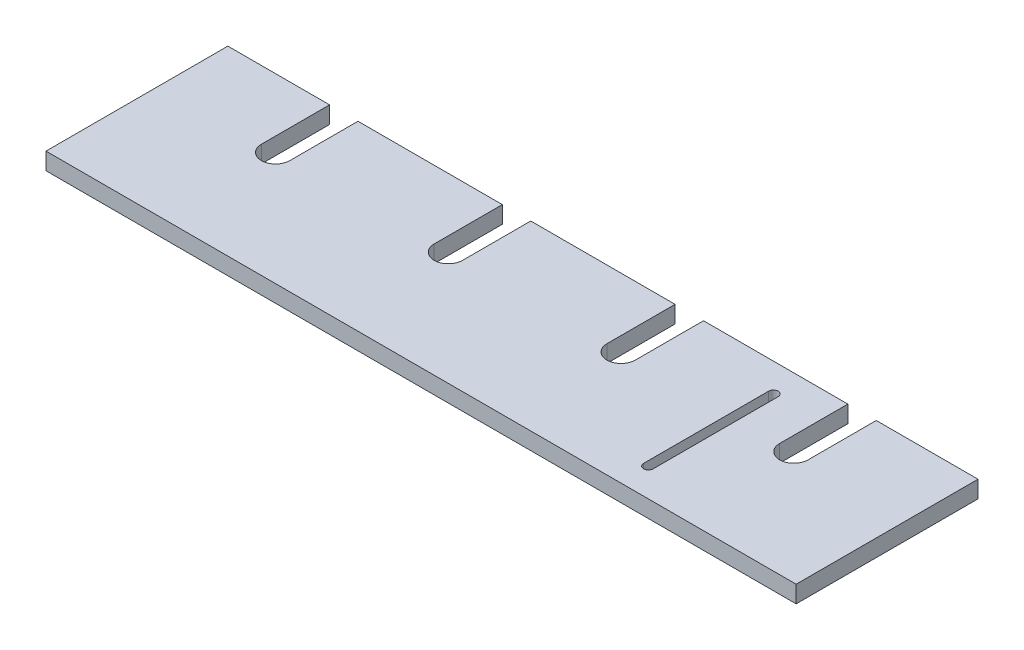
ISO-10303-21;
HEADER;
FILE_DESCRIPTION(('STEP AP214'),'2;1');
FILE_NAME('part.step','',(''),(''),'','','');
FILE_SCHEMA(('AUTOMOTIVE_DESIGN { 1 0 10303 214 1 1 1 1 }'));
ENDSEC;
DATA;
#1=APPLICATION_CONTEXT('core data for automotive mechanical design processes');
#2=APPLICATION_PROTOCOL_DEFINITION('international standard','automotive_design',2000,#1);
#3=PRODUCT_CONTEXT('',#1,'mechanical');
#4=PRODUCT('Part','Part','',(#3));
#5=PRODUCT_RELATED_PRODUCT_CATEGORY('part','',(#4));
#6=PRODUCT_DEFINITION_FORMATION('','',#4);
#7=PRODUCT_DEFINITION_CONTEXT('part definition',#1,'design');
#8=PRODUCT_DEFINITION('design','',#6,#7);
#9=PRODUCT_DEFINITION_SHAPE('','',#8);
#10=(LENGTH_UNIT() NAMED_UNIT(*) SI_UNIT(.MILLI.,.METRE.));
#11=(NAMED_UNIT(*) PLANE_ANGLE_UNIT() SI_UNIT($,.RADIAN.));
#12=(NAMED_UNIT(*) SI_UNIT($,.STERADIAN.) SOLID_ANGLE_UNIT());
#13=UNCERTAINTY_MEASURE_WITH_UNIT(LENGTH_MEASURE(1.E-05),#10,'distance_accuracy_value','');
#14=(GEOMETRIC_REPRESENTATION_CONTEXT(3) GLOBAL_UNCERTAINTY_ASSIGNED_CONTEXT((#13)) GLOBAL_UNIT_ASSIGNED_CONTEXT((#10,
#11,#12)) REPRESENTATION_CONTEXT('',''));
#15=CARTESIAN_POINT('',(0.,0.,0.));
#16=DIRECTION('',(0.,0.,1.));
#17=DIRECTION('',(1.,0.,0.));
#18=AXIS2_PLACEMENT_3D('',#15,#16,#17);
#19=CARTESIAN_POINT('',(-209.55,9.525,-50.8));
#20=DIRECTION('',(0.,0.,1.));
#21=DIRECTION('',(1.,0.,0.));
#22=AXIS2_PLACEMENT_3D('',#19,#20,#21);
#23=PLANE('',#22);
#24=DIRECTION('',(0.,-1.,0.));
#25=VECTOR('',#24,1.);
#26=CARTESIAN_POINT('',(-136.8425,9.526,-50.8));
#27=LINE('',#26,#25);
#28=CARTESIAN_POINT('',(-136.8425,0.,-50.8));
#29=VERTEX_POINT('',#28);
#30=CARTESIAN_POINT('',(-136.8425,9.525,-50.8));
#31=VERTEX_POINT('',#30);
#32=EDGE_CURVE('E252',#29,#31,#27,.F.);
#33=ORIENTED_EDGE('',*,*,#32,.T.);
#34=DIRECTION('',(-1.,0.,0.));
#35=VECTOR('',#34,1.);
#36=CARTESIAN_POINT('',(-209.55,9.525,-50.8));
#37=LINE('',#36,#35);
#38=CARTESIAN_POINT('',(-56.1975,9.525,-50.8));
#39=VERTEX_POINT('',#38);
#40=EDGE_CURVE('E456',#39,#31,#37,.T.);
#41=ORIENTED_EDGE('',*,*,#40,.F.);
#42=DIRECTION('',(0.,-1.,0.));
#43=VECTOR('',#42,1.);
#44=CARTESIAN_POINT('',(-56.1975,9.526,-50.8));
#45=LINE('',#44,#43);
#46=CARTESIAN_POINT('',(-56.1975,0.,-50.8));
#47=VERTEX_POINT('',#46);
#48=EDGE_CURVE('E292',#39,#47,#45,.T.);
#49=ORIENTED_EDGE('',*,*,#48,.T.);
#50=DIRECTION('',(-1.,0.,0.));
#51=VECTOR('',#50,1.);
#52=CARTESIAN_POINT('',(-209.55,0.,-50.8));
#53=LINE('',#52,#51);
#54=EDGE_CURVE('E505',#47,#29,#53,.T.);
#55=ORIENTED_EDGE('',*,*,#54,.T.);
#56=EDGE_LOOP('',(#33,#41,#49,#55));
#57=FACE_BOUND('',#56,.T.);
#58=ADVANCED_FACE('F38',(#57),#23,.F.);
#59=DIRECTION('',(0.,-1.,0.));
#60=VECTOR('',#59,1.);
#61=CARTESIAN_POINT('',(-152.7175,9.526,-50.8));
#62=LINE('',#61,#60);
#63=CARTESIAN_POINT('',(-152.7175,9.525,-50.8));
#64=VERTEX_POINT('',#63);
#65=CARTESIAN_POINT('',(-152.7175,0.,-50.8));
#66=VERTEX_POINT('',#65);
#67=EDGE_CURVE('E248',#64,#66,#62,.T.);
#68=ORIENTED_EDGE('',*,*,#67,.T.);
#69=CARTESIAN_POINT('',(-209.55,0.,-50.8));
#70=VERTEX_POINT('',#69);
#71=EDGE_CURVE('E414',#66,#70,#53,.T.);
#72=ORIENTED_EDGE('',*,*,#71,.T.);
#73=DIRECTION('',(0.,-1.,0.));
#74=VECTOR('',#73,1.);
#75=CARTESIAN_POINT('',(-209.55,9.525,-50.8));
#76=LINE('',#75,#74);
#77=CARTESIAN_POINT('',(-209.55,9.525,-50.8));
#78=VERTEX_POINT('',#77);
#79=EDGE_CURVE('E47',#78,#70,#76,.T.);
#80=ORIENTED_EDGE('',*,*,#79,.F.);
#81=EDGE_CURVE('E397',#64,#78,#37,.T.);
#82=ORIENTED_EDGE('',*,*,#81,.F.);
#83=EDGE_LOOP('',(#68,#72,#80,#82));
#84=FACE_BOUND('',#83,.T.);
#85=ADVANCED_FACE('F514',(#84),#23,.F.);
#86=DIRECTION('',(0.,1.,0.));
#87=VECTOR('',#86,1.);
#88=CARTESIAN_POINT('',(-40.3225,9.526,-50.8));
#89=LINE('',#88,#87);
#90=CARTESIAN_POINT('',(-40.3225,0.,-50.8));
#91=VERTEX_POINT('',#90);
#92=CARTESIAN_POINT('',(-40.3225,9.525,-50.8));
#93=VERTEX_POINT('',#92);
#94=EDGE_CURVE('E216',#91,#93,#89,.T.);
#95=ORIENTED_EDGE('',*,*,#94,.T.);
#96=CARTESIAN_POINT('',(40.3225,9.525,-50.8));
#97=VERTEX_POINT('',#96);
#98=EDGE_CURVE('E459',#97,#93,#37,.T.);
#99=ORIENTED_EDGE('',*,*,#98,.F.);
#100=DIRECTION('',(0.,1.,0.));
#101=VECTOR('',#100,1.);
#102=CARTESIAN_POINT('',(40.3225,9.526,-50.8));
#103=LINE('',#102,#101);
#104=CARTESIAN_POINT('',(40.3225,0.,-50.8));
#105=VERTEX_POINT('',#104);
#106=EDGE_CURVE('E363',#105,#97,#103,.T.);
#107=ORIENTED_EDGE('',*,*,#106,.F.);
#108=EDGE_CURVE('E492',#105,#91,#53,.T.);
#109=ORIENTED_EDGE('',*,*,#108,.T.);
#110=EDGE_LOOP('',(#95,#99,#107,#109));
#111=FACE_BOUND('',#110,.T.);
#112=ADVANCED_FACE('F490',(#111),#23,.F.);
#113=CARTESIAN_POINT('',(0.,9.525,0.));
#114=DIRECTION('',(0.,-1.,0.));
#115=DIRECTION('',(0.,0.,-1.));
#116=AXIS2_PLACEMENT_3D('',#113,#114,#115);
#117=PLANE('',#116);
#118=DIRECTION('',(0.,0.,1.));
#119=VECTOR('',#118,1.);
#120=CARTESIAN_POINT('',(113.792,9.525,34.925));
#121=LINE('',#120,#119);
#122=CARTESIAN_POINT('',(113.792,9.525,-34.925));
#123=VERTEX_POINT('',#122);
#124=CARTESIAN_POINT('',(113.792,9.525,34.925));
#125=VERTEX_POINT('',#124);
#126=EDGE_CURVE('E222',#123,#125,#121,.T.);
#127=ORIENTED_EDGE('',*,*,#126,.T.);
#128=CARTESIAN_POINT('',(111.125,9.525,34.925));
#129=DIRECTION('',(0.,-1.,0.));
#130=DIRECTION('',(0.,0.,-1.));
#131=AXIS2_PLACEMENT_3D('',#128,#129,#130);
#132=CIRCLE('',#131,2.667);
#133=CARTESIAN_POINT('',(108.458,9.525,34.925));
#134=VERTEX_POINT('',#133);
#135=EDGE_CURVE('E202',#134,#125,#132,.F.);
#136=ORIENTED_EDGE('',*,*,#135,.F.);
#137=DIRECTION('',(0.,0.,1.));
#138=VECTOR('',#137,1.);
#139=CARTESIAN_POINT('',(108.458,9.525,34.925));
#140=LINE('',#139,#138);
#141=CARTESIAN_POINT('',(108.458,9.525,-34.925));
#142=VERTEX_POINT('',#141);
#143=EDGE_CURVE('E212',#142,#134,#140,.T.);
#144=ORIENTED_EDGE('',*,*,#143,.F.);
#145=CARTESIAN_POINT('',(111.125,9.525,-34.925));
#146=DIRECTION('',(0.,-1.,0.));
#147=DIRECTION('',(0.,0.,-1.));
#148=AXIS2_PLACEMENT_3D('',#145,#146,#147);
#149=CIRCLE('',#148,2.667);
#150=EDGE_CURVE('E54',#123,#142,#149,.F.);
#151=ORIENTED_EDGE('',*,*,#150,.F.);
#152=EDGE_LOOP('',(#127,#136,#144,#151));
#153=FACE_BOUND('',#152,.T.);
#154=DIRECTION('',(0.,0.,1.));
#155=VECTOR('',#154,1.);
#156=CARTESIAN_POINT('',(-136.8425,9.525,-12.7));
#157=LINE('',#156,#155);
#158=CARTESIAN_POINT('',(-136.8425,9.525,-12.7));
#159=VERTEX_POINT('',#158);
#160=EDGE_CURVE('E261',#31,#159,#157,.T.);
#161=ORIENTED_EDGE('',*,*,#160,.T.);
#162=CARTESIAN_POINT('',(-144.78,9.525,-12.7));
#163=DIRECTION('',(0.,-1.,0.));
#164=DIRECTION('',(0.,0.,-1.));
#165=AXIS2_PLACEMENT_3D('',#162,#163,#164);
#166=CIRCLE('',#165,7.93749999999999);
#167=CARTESIAN_POINT('',(-152.7175,9.525,-12.7));
#168=VERTEX_POINT('',#167);
#169=EDGE_CURVE('E257',#159,#168,#166,.T.);
#170=ORIENTED_EDGE('',*,*,#169,.T.);
#171=DIRECTION('',(0.,0.,-1.));
#172=VECTOR('',#171,1.);
#173=CARTESIAN_POINT('',(-152.7175,9.525,-12.7));
#174=LINE('',#173,#172);
#175=EDGE_CURVE('E281',#168,#64,#174,.T.);
#176=ORIENTED_EDGE('',*,*,#175,.T.);
#177=ORIENTED_EDGE('',*,*,#81,.T.);
#178=DIRECTION('',(0.,0.,1.));
#179=VECTOR('',#178,1.);
#180=CARTESIAN_POINT('',(-209.55,9.525,50.8));
#181=LINE('',#180,#179);
#182=CARTESIAN_POINT('',(-209.55,9.525,50.8));
#183=VERTEX_POINT('',#182);
#184=EDGE_CURVE('E403',#78,#183,#181,.T.);
#185=ORIENTED_EDGE('',*,*,#184,.T.);
#186=DIRECTION('',(1.,0.,0.));
#187=VECTOR('',#186,1.);
#188=CARTESIAN_POINT('',(-209.55,9.525,50.8));
#189=LINE('',#188,#187);
#190=CARTESIAN_POINT('',(209.55,9.525,50.8));
#191=VERTEX_POINT('',#190);
#192=EDGE_CURVE('E407',#183,#191,#189,.T.);
#193=ORIENTED_EDGE('',*,*,#192,.T.);
#194=DIRECTION('',(0.,0.,-1.));
#195=VECTOR('',#194,1.);
#196=CARTESIAN_POINT('',(209.55,9.525,50.8));
#197=LINE('',#196,#195);
#198=CARTESIAN_POINT('',(209.55,9.525,-50.8));
#199=VERTEX_POINT('',#198);
#200=EDGE_CURVE('E393',#191,#199,#197,.T.);
#201=ORIENTED_EDGE('',*,*,#200,.T.);
#202=CARTESIAN_POINT('',(152.7175,9.525,-50.8));
#203=VERTEX_POINT('',#202);
#204=EDGE_CURVE('E399',#199,#203,#37,.T.);
#205=ORIENTED_EDGE('',*,*,#204,.T.);
#206=DIRECTION('',(0.,0.,-1.));
#207=VECTOR('',#206,1.);
#208=CARTESIAN_POINT('',(152.7175,9.525,-12.7));
#209=LINE('',#208,#207);
#210=CARTESIAN_POINT('',(152.7175,9.525,-12.7));
#211=VERTEX_POINT('',#210);
#212=EDGE_CURVE('E336',#211,#203,#209,.T.);
#213=ORIENTED_EDGE('',*,*,#212,.F.);
#214=CARTESIAN_POINT('',(144.78,9.525,-12.7));
#215=DIRECTION('',(0.,-1.,0.));
#216=DIRECTION('',(0.,0.,-1.));
#217=AXIS2_PLACEMENT_3D('',#214,#215,#216);
#218=CIRCLE('',#217,7.93749999999999);
#219=CARTESIAN_POINT('',(136.8425,9.525,-12.7));
#220=VERTEX_POINT('',#219);
#221=EDGE_CURVE('E332',#220,#211,#218,.F.);
#222=ORIENTED_EDGE('',*,*,#221,.F.);
#223=DIRECTION('',(0.,0.,1.));
#224=VECTOR('',#223,1.);
#225=CARTESIAN_POINT('',(136.8425,9.525,-12.7));
#226=LINE('',#225,#224);
#227=CARTESIAN_POINT('',(136.8425,9.525,-50.8));
#228=VERTEX_POINT('',#227);
#229=EDGE_CURVE('E353',#228,#220,#226,.T.);
#230=ORIENTED_EDGE('',*,*,#229,.F.);
#231=CARTESIAN_POINT('',(56.1975,9.525,-50.8));
#232=VERTEX_POINT('',#231);
#233=EDGE_CURVE('E404',#228,#232,#37,.T.);
#234=ORIENTED_EDGE('',*,*,#233,.T.);
#235=DIRECTION('',(0.,0.,-1.));
#236=VECTOR('',#235,1.);
#237=CARTESIAN_POINT('',(56.1975,9.525,-50.8));
#238=LINE('',#237,#236);
#239=CARTESIAN_POINT('',(56.1975,9.525,-12.7));
#240=VERTEX_POINT('',#239);
#241=EDGE_CURVE('E329',#240,#232,#238,.T.);
#242=ORIENTED_EDGE('',*,*,#241,.F.);
#243=CARTESIAN_POINT('',(48.26,9.525,-12.7));
#244=DIRECTION('',(0.,-1.,0.));
#245=DIRECTION('',(0.,0.,-1.));
#246=AXIS2_PLACEMENT_3D('',#243,#244,#245);
#247=CIRCLE('',#246,7.93749999999999);
#248=CARTESIAN_POINT('',(40.3225,9.525,-12.7));
#249=VERTEX_POINT('',#248);
#250=EDGE_CURVE('E366',#249,#240,#247,.F.);
#251=ORIENTED_EDGE('',*,*,#250,.F.);
#252=DIRECTION('',(0.,0.,1.));
#253=VECTOR('',#252,1.);
#254=CARTESIAN_POINT('',(40.3225,9.525,-50.8));
#255=LINE('',#254,#253);
#256=EDGE_CURVE('E370',#97,#249,#255,.T.);
#257=ORIENTED_EDGE('',*,*,#256,.F.);
#258=ORIENTED_EDGE('',*,*,#98,.T.);
#259=DIRECTION('',(0.,0.,1.));
#260=VECTOR('',#259,1.);
#261=CARTESIAN_POINT('',(-40.3225,9.525,-50.8));
#262=LINE('',#261,#260);
#263=CARTESIAN_POINT('',(-40.3225,9.525,-12.7));
#264=VERTEX_POINT('',#263);
#265=EDGE_CURVE('E253',#93,#264,#262,.T.);
#266=ORIENTED_EDGE('',*,*,#265,.T.);
#267=CARTESIAN_POINT('',(-48.26,9.525,-12.7));
#268=DIRECTION('',(0.,-1.,0.));
#269=DIRECTION('',(0.,0.,-1.));
#270=AXIS2_PLACEMENT_3D('',#267,#268,#269);
#271=CIRCLE('',#270,7.93749999999999);
#272=CARTESIAN_POINT('',(-56.1975,9.525,-12.7));
#273=VERTEX_POINT('',#272);
#274=EDGE_CURVE('E296',#264,#273,#271,.T.);
#275=ORIENTED_EDGE('',*,*,#274,.T.);
#276=DIRECTION('',(0.,0.,-1.));
#277=VECTOR('',#276,1.);
#278=CARTESIAN_POINT('',(-56.1975,9.525,-50.8));
#279=LINE('',#278,#277);
#280=EDGE_CURVE('E300',#273,#39,#279,.T.);
#281=ORIENTED_EDGE('',*,*,#280,.T.);
#282=ORIENTED_EDGE('',*,*,#40,.T.);
#283=EDGE_LOOP('',(#161,#170,#176,#177,#185,#193,#201,#205,#213,#222,#230,#234,#242,#251,#257,
#258,#266,#275,#281,#282));
#284=FACE_BOUND('',#283,.T.);
#285=ADVANCED_FACE('F219',(#153,#284),#117,.F.);
#286=CARTESIAN_POINT('',(0.,0.,0.));
#287=DIRECTION('',(0.,-1.,0.));
#288=DIRECTION('',(0.,0.,-1.));
#289=AXIS2_PLACEMENT_3D('',#286,#287,#288);
#290=PLANE('',#289);
#291=CARTESIAN_POINT('',(111.125,0.,34.925));
#292=DIRECTION('',(0.,-1.,0.));
#293=DIRECTION('',(0.,0.,-1.));
#294=AXIS2_PLACEMENT_3D('',#291,#292,#293);
#295=CIRCLE('',#294,2.667);
#296=CARTESIAN_POINT('',(113.792,0.,34.925));
#297=VERTEX_POINT('',#296);
#298=CARTESIAN_POINT('',(108.458,0.,34.925));
#299=VERTEX_POINT('',#298);
#300=EDGE_CURVE('E62',#297,#299,#295,.T.);
#301=ORIENTED_EDGE('',*,*,#300,.F.);
#302=DIRECTION('',(0.,0.,-1.));
#303=VECTOR('',#302,1.);
#304=CARTESIAN_POINT('',(113.792,0.,34.925));
#305=LINE('',#304,#303);
#306=CARTESIAN_POINT('',(113.792,0.,-34.925));
#307=VERTEX_POINT('',#306);
#308=EDGE_CURVE('E209',#297,#307,#305,.T.);
#309=ORIENTED_EDGE('',*,*,#308,.T.);
#310=CARTESIAN_POINT('',(111.125,0.,-34.925));
#311=DIRECTION('',(0.,-1.,0.));
#312=DIRECTION('',(0.,0.,-1.));
#313=AXIS2_PLACEMENT_3D('',#310,#311,#312);
#314=CIRCLE('',#313,2.667);
#315=CARTESIAN_POINT('',(108.458,0.,-34.925));
#316=VERTEX_POINT('',#315);
#317=EDGE_CURVE('E234',#316,#307,#314,.T.);
#318=ORIENTED_EDGE('',*,*,#317,.F.);
#319=DIRECTION('',(0.,0.,-1.));
#320=VECTOR('',#319,1.);
#321=CARTESIAN_POINT('',(108.458,0.,34.925));
#322=LINE('',#321,#320);
#323=EDGE_CURVE('E227',#299,#316,#322,.T.);
#324=ORIENTED_EDGE('',*,*,#323,.F.);
#325=EDGE_LOOP('',(#301,#309,#318,#324));
#326=FACE_BOUND('',#325,.T.);
#327=CARTESIAN_POINT('',(-144.78,0.,-12.7));
#328=DIRECTION('',(0.,1.,0.));
#329=DIRECTION('',(0.,0.,-1.));
#330=AXIS2_PLACEMENT_3D('',#327,#328,#329);
#331=CIRCLE('',#330,7.93749999999999);
#332=CARTESIAN_POINT('',(-152.7175,0.,-12.7));
#333=VERTEX_POINT('',#332);
#334=CARTESIAN_POINT('',(-136.8425,0.,-12.7));
#335=VERTEX_POINT('',#334);
#336=EDGE_CURVE('E265',#333,#335,#331,.T.);
#337=ORIENTED_EDGE('',*,*,#336,.T.);
#338=DIRECTION('',(0.,0.,-1.));
#339=VECTOR('',#338,1.);
#340=CARTESIAN_POINT('',(-136.8425,0.,-12.7));
#341=LINE('',#340,#339);
#342=EDGE_CURVE('E273',#335,#29,#341,.T.);
#343=ORIENTED_EDGE('',*,*,#342,.T.);
#344=ORIENTED_EDGE('',*,*,#54,.F.);
#345=DIRECTION('',(0.,0.,1.));
#346=VECTOR('',#345,1.);
#347=CARTESIAN_POINT('',(-56.1975,0.,-50.8));
#348=LINE('',#347,#346);
#349=CARTESIAN_POINT('',(-56.1975,0.,-12.7));
#350=VERTEX_POINT('',#349);
#351=EDGE_CURVE('E312',#47,#350,#348,.T.);
#352=ORIENTED_EDGE('',*,*,#351,.T.);
#353=CARTESIAN_POINT('',(-48.26,0.,-12.7));
#354=DIRECTION('',(0.,1.,0.));
#355=DIRECTION('',(0.,0.,-1.));
#356=AXIS2_PLACEMENT_3D('',#353,#354,#355);
#357=CIRCLE('',#356,7.93749999999999);
#358=CARTESIAN_POINT('',(-40.3225,0.,-12.7));
#359=VERTEX_POINT('',#358);
#360=EDGE_CURVE('E308',#350,#359,#357,.T.);
#361=ORIENTED_EDGE('',*,*,#360,.T.);
#362=DIRECTION('',(0.,0.,-1.));
#363=VECTOR('',#362,1.);
#364=CARTESIAN_POINT('',(-40.3225,0.,-50.8));
#365=LINE('',#364,#363);
#366=EDGE_CURVE('E304',#359,#91,#365,.T.);
#367=ORIENTED_EDGE('',*,*,#366,.T.);
#368=ORIENTED_EDGE('',*,*,#108,.F.);
#369=DIRECTION('',(0.,0.,-1.));
#370=VECTOR('',#369,1.);
#371=CARTESIAN_POINT('',(40.3225,0.,-50.8));
#372=LINE('',#371,#370);
#373=CARTESIAN_POINT('',(40.3225,0.,-12.7));
#374=VERTEX_POINT('',#373);
#375=EDGE_CURVE('E382',#374,#105,#372,.T.);
#376=ORIENTED_EDGE('',*,*,#375,.F.);
#377=CARTESIAN_POINT('',(48.26,0.,-12.7));
#378=DIRECTION('',(0.,-1.,0.));
#379=DIRECTION('',(0.,0.,-1.));
#380=AXIS2_PLACEMENT_3D('',#377,#378,#379);
#381=CIRCLE('',#380,7.93749999999999);
#382=CARTESIAN_POINT('',(56.1975,0.,-12.7));
#383=VERTEX_POINT('',#382);
#384=EDGE_CURVE('E378',#383,#374,#381,.T.);
#385=ORIENTED_EDGE('',*,*,#384,.F.);
#386=DIRECTION('',(0.,0.,1.));
#387=VECTOR('',#386,1.);
#388=CARTESIAN_POINT('',(56.1975,0.,-50.8));
#389=LINE('',#388,#387);
#390=CARTESIAN_POINT('',(56.1975,0.,-50.8));
#391=VERTEX_POINT('',#390);
#392=EDGE_CURVE('E374',#391,#383,#389,.T.);
#393=ORIENTED_EDGE('',*,*,#392,.F.);
#394=CARTESIAN_POINT('',(136.8425,0.,-50.8));
#395=VERTEX_POINT('',#394);
#396=EDGE_CURVE('E420',#395,#391,#53,.T.);
#397=ORIENTED_EDGE('',*,*,#396,.F.);
#398=DIRECTION('',(0.,0.,-1.));
#399=VECTOR('',#398,1.);
#400=CARTESIAN_POINT('',(136.8425,0.,-12.7));
#401=LINE('',#400,#399);
#402=CARTESIAN_POINT('',(136.8425,0.,-12.7));
#403=VERTEX_POINT('',#402);
#404=EDGE_CURVE('E342',#403,#395,#401,.T.);
#405=ORIENTED_EDGE('',*,*,#404,.F.);
#406=CARTESIAN_POINT('',(144.78,0.,-12.7));
#407=DIRECTION('',(0.,-1.,0.));
#408=DIRECTION('',(0.,0.,-1.));
#409=AXIS2_PLACEMENT_3D('',#406,#407,#408);
#410=CIRCLE('',#409,7.93749999999999);
#411=CARTESIAN_POINT('',(152.7175,0.,-12.7));
#412=VERTEX_POINT('',#411);
#413=EDGE_CURVE('E339',#412,#403,#410,.T.);
#414=ORIENTED_EDGE('',*,*,#413,.F.);
#415=DIRECTION('',(0.,0.,1.));
#416=VECTOR('',#415,1.);
#417=CARTESIAN_POINT('',(152.7175,0.,-12.7));
#418=LINE('',#417,#416);
#419=CARTESIAN_POINT('',(152.7175,0.,-50.8));
#420=VERTEX_POINT('',#419);
#421=EDGE_CURVE('E345',#420,#412,#418,.T.);
#422=ORIENTED_EDGE('',*,*,#421,.F.);
#423=CARTESIAN_POINT('',(209.55,0.,-50.8));
#424=VERTEX_POINT('',#423);
#425=EDGE_CURVE('E415',#424,#420,#53,.T.);
#426=ORIENTED_EDGE('',*,*,#425,.F.);
#427=DIRECTION('',(0.,0.,-1.));
#428=VECTOR('',#427,1.);
#429=CARTESIAN_POINT('',(209.55,0.,50.8));
#430=LINE('',#429,#428);
#431=CARTESIAN_POINT('',(209.55,0.,50.8));
#432=VERTEX_POINT('',#431);
#433=EDGE_CURVE('E360',#432,#424,#430,.T.);
#434=ORIENTED_EDGE('',*,*,#433,.F.);
#435=DIRECTION('',(1.,0.,0.));
#436=VECTOR('',#435,1.);
#437=CARTESIAN_POINT('',(-209.55,0.,50.8));
#438=LINE('',#437,#436);
#439=CARTESIAN_POINT('',(-209.55,0.,50.8));
#440=VERTEX_POINT('',#439);
#441=EDGE_CURVE('E398',#440,#432,#438,.T.);
#442=ORIENTED_EDGE('',*,*,#441,.F.);
#443=DIRECTION('',(0.,0.,1.));
#444=VECTOR('',#443,1.);
#445=CARTESIAN_POINT('',(-209.55,0.,50.8));
#446=LINE('',#445,#444);
#447=EDGE_CURVE('E419',#70,#440,#446,.T.);
#448=ORIENTED_EDGE('',*,*,#447,.F.);
#449=ORIENTED_EDGE('',*,*,#71,.F.);
#450=DIRECTION('',(0.,0.,1.));
#451=VECTOR('',#450,1.);
#452=CARTESIAN_POINT('',(-152.7175,0.,-12.7));
#453=LINE('',#452,#451);
#454=EDGE_CURVE('E269',#66,#333,#453,.T.);
#455=ORIENTED_EDGE('',*,*,#454,.T.);
#456=EDGE_LOOP('',(#337,#343,#344,#352,#361,#367,#368,#376,#385,#393,#397,#405,#414,#422,#426,
#434,#442,#448,#449,#455));
#457=FACE_BOUND('',#456,.T.);
#458=ADVANCED_FACE('F444',(#326,#457),#290,.T.);
#459=ORIENTED_EDGE('',*,*,#425,.T.);
#460=DIRECTION('',(0.,-1.,0.));
#461=VECTOR('',#460,1.);
#462=CARTESIAN_POINT('',(152.7175,9.526,-50.8));
#463=LINE('',#462,#461);
#464=EDGE_CURVE('E328',#203,#420,#463,.T.);
#465=ORIENTED_EDGE('',*,*,#464,.F.);
#466=ORIENTED_EDGE('',*,*,#204,.F.);
#467=DIRECTION('',(0.,-1.,0.));
#468=VECTOR('',#467,1.);
#469=CARTESIAN_POINT('',(209.55,9.525,-50.8));
#470=LINE('',#469,#468);
#471=EDGE_CURVE('E11',#199,#424,#470,.T.);
#472=ORIENTED_EDGE('',*,*,#471,.T.);
#473=EDGE_LOOP('',(#459,#465,#466,#472));
#474=FACE_BOUND('',#473,.T.);
#475=ADVANCED_FACE('F524',(#474),#23,.F.);
#476=CARTESIAN_POINT('',(209.55,9.525,50.8));
#477=DIRECTION('',(-1.,0.,0.));
#478=DIRECTION('',(0.,0.,1.));
#479=AXIS2_PLACEMENT_3D('',#476,#477,#478);
#480=PLANE('',#479);
#481=ORIENTED_EDGE('',*,*,#433,.T.);
#482=ORIENTED_EDGE('',*,*,#471,.F.);
#483=ORIENTED_EDGE('',*,*,#200,.F.);
#484=DIRECTION('',(0.,-1.,0.));
#485=VECTOR('',#484,1.);
#486=CARTESIAN_POINT('',(209.55,9.525,50.8));
#487=LINE('',#486,#485);
#488=EDGE_CURVE('E410',#191,#432,#487,.T.);
#489=ORIENTED_EDGE('',*,*,#488,.T.);
#490=EDGE_LOOP('',(#481,#482,#483,#489));
#491=FACE_BOUND('',#490,.T.);
#492=ADVANCED_FACE('F40',(#491),#480,.F.);
#493=ORIENTED_EDGE('',*,*,#233,.F.);
#494=DIRECTION('',(0.,1.,0.));
#495=VECTOR('',#494,1.);
#496=CARTESIAN_POINT('',(136.8425,9.526,-50.8));
#497=LINE('',#496,#495);
#498=EDGE_CURVE('E325',#395,#228,#497,.T.);
#499=ORIENTED_EDGE('',*,*,#498,.F.);
#500=ORIENTED_EDGE('',*,*,#396,.T.);
#501=DIRECTION('',(0.,-1.,0.));
#502=VECTOR('',#501,1.);
#503=CARTESIAN_POINT('',(56.1975,9.526,-50.8));
#504=LINE('',#503,#502);
#505=EDGE_CURVE('E288',#232,#391,#504,.T.);
#506=ORIENTED_EDGE('',*,*,#505,.F.);
#507=EDGE_LOOP('',(#493,#499,#500,#506));
#508=FACE_BOUND('',#507,.T.);
#509=ADVANCED_FACE('F475',(#508),#23,.F.);
#510=CARTESIAN_POINT('',(-209.55,9.525,50.8));
#511=DIRECTION('',(1.,0.,0.));
#512=DIRECTION('',(0.,0.,-1.));
#513=AXIS2_PLACEMENT_3D('',#510,#511,#512);
#514=PLANE('',#513);
#515=ORIENTED_EDGE('',*,*,#447,.T.);
#516=DIRECTION('',(0.,-1.,0.));
#517=VECTOR('',#516,1.);
#518=CARTESIAN_POINT('',(-209.55,9.525,50.8));
#519=LINE('',#518,#517);
#520=EDGE_CURVE('E428',#183,#440,#519,.T.);
#521=ORIENTED_EDGE('',*,*,#520,.F.);
#522=ORIENTED_EDGE('',*,*,#184,.F.);
#523=ORIENTED_EDGE('',*,*,#79,.T.);
#524=EDGE_LOOP('',(#515,#521,#522,#523));
#525=FACE_BOUND('',#524,.T.);
#526=ADVANCED_FACE('F437',(#525),#514,.F.);
#527=CARTESIAN_POINT('',(-209.55,9.525,50.8));
#528=DIRECTION('',(0.,0.,-1.));
#529=DIRECTION('',(-1.,0.,0.));
#530=AXIS2_PLACEMENT_3D('',#527,#528,#529);
#531=PLANE('',#530);
#532=ORIENTED_EDGE('',*,*,#441,.T.);
#533=ORIENTED_EDGE('',*,*,#488,.F.);
#534=ORIENTED_EDGE('',*,*,#192,.F.);
#535=ORIENTED_EDGE('',*,*,#520,.T.);
#536=EDGE_LOOP('',(#532,#533,#534,#535));
#537=FACE_BOUND('',#536,.T.);
#538=ADVANCED_FACE('F448',(#537),#531,.F.);
#539=CARTESIAN_POINT('',(40.3225,9.526,-50.8));
#540=DIRECTION('',(-1.,0.,0.));
#541=DIRECTION('',(0.,0.,1.));
#542=AXIS2_PLACEMENT_3D('',#539,#540,#541);
#543=PLANE('',#542);
#544=ORIENTED_EDGE('',*,*,#256,.T.);
#545=DIRECTION('',(0.,-1.,0.));
#546=VECTOR('',#545,1.);
#547=CARTESIAN_POINT('',(40.3225,9.526,-12.7));
#548=LINE('',#547,#546);
#549=EDGE_CURVE('E386',#249,#374,#548,.T.);
#550=ORIENTED_EDGE('',*,*,#549,.T.);
#551=ORIENTED_EDGE('',*,*,#375,.T.);
#552=ORIENTED_EDGE('',*,*,#106,.T.);
#553=EDGE_LOOP('',(#544,#550,#551,#552));
#554=FACE_BOUND('',#553,.T.);
#555=ADVANCED_FACE('F531',(#554),#543,.F.);
#556=CARTESIAN_POINT('',(48.26,9.526,-12.7));
#557=DIRECTION('',(0.,-1.,0.));
#558=DIRECTION('',(0.,0.,-1.));
#559=AXIS2_PLACEMENT_3D('',#556,#557,#558);
#560=CYLINDRICAL_SURFACE('',#559,7.93749999999999);
#561=ORIENTED_EDGE('',*,*,#250,.T.);
#562=DIRECTION('',(0.,-1.,0.));
#563=VECTOR('',#562,1.);
#564=CARTESIAN_POINT('',(56.1975,9.526,-12.7));
#565=LINE('',#564,#563);
#566=EDGE_CURVE('E385',#240,#383,#565,.T.);
#567=ORIENTED_EDGE('',*,*,#566,.T.);
#568=ORIENTED_EDGE('',*,*,#384,.T.);
#569=ORIENTED_EDGE('',*,*,#549,.F.);
#570=EDGE_LOOP('',(#561,#567,#568,#569));
#571=FACE_BOUND('',#570,.T.);
#572=ADVANCED_FACE('F486',(#571),#560,.F.);
#573=CARTESIAN_POINT('',(56.1975,9.526,-50.8));
#574=DIRECTION('',(1.,0.,0.));
#575=DIRECTION('',(0.,0.,-1.));
#576=AXIS2_PLACEMENT_3D('',#573,#574,#575);
#577=PLANE('',#576);
#578=ORIENTED_EDGE('',*,*,#241,.T.);
#579=ORIENTED_EDGE('',*,*,#505,.T.);
#580=ORIENTED_EDGE('',*,*,#392,.T.);
#581=ORIENTED_EDGE('',*,*,#566,.F.);
#582=EDGE_LOOP('',(#578,#579,#580,#581));
#583=FACE_BOUND('',#582,.T.);
#584=ADVANCED_FACE('F480',(#583),#577,.F.);
#585=CARTESIAN_POINT('',(144.78,9.526,-12.7));
#586=DIRECTION('',(0.,-1.,0.));
#587=DIRECTION('',(0.,0.,-1.));
#588=AXIS2_PLACEMENT_3D('',#585,#586,#587);
#589=CYLINDRICAL_SURFACE('',#588,7.93749999999999);
#590=ORIENTED_EDGE('',*,*,#221,.T.);
#591=DIRECTION('',(0.,-1.,0.));
#592=VECTOR('',#591,1.);
#593=CARTESIAN_POINT('',(152.7175,9.526,-12.7));
#594=LINE('',#593,#592);
#595=EDGE_CURVE('E350',#211,#412,#594,.T.);
#596=ORIENTED_EDGE('',*,*,#595,.T.);
#597=ORIENTED_EDGE('',*,*,#413,.T.);
#598=DIRECTION('',(0.,-1.,0.));
#599=VECTOR('',#598,1.);
#600=CARTESIAN_POINT('',(136.8425,9.526,-12.7));
#601=LINE('',#600,#599);
#602=EDGE_CURVE('E349',#220,#403,#601,.T.);
#603=ORIENTED_EDGE('',*,*,#602,.F.);
#604=EDGE_LOOP('',(#590,#596,#597,#603));
#605=FACE_BOUND('',#604,.T.);
#606=ADVANCED_FACE('F539',(#605),#589,.F.);
#607=CARTESIAN_POINT('',(152.7175,9.526,-12.7));
#608=DIRECTION('',(1.,0.,0.));
#609=DIRECTION('',(0.,0.,-1.));
#610=AXIS2_PLACEMENT_3D('',#607,#608,#609);
#611=PLANE('',#610);
#612=ORIENTED_EDGE('',*,*,#212,.T.);
#613=ORIENTED_EDGE('',*,*,#464,.T.);
#614=ORIENTED_EDGE('',*,*,#421,.T.);
#615=ORIENTED_EDGE('',*,*,#595,.F.);
#616=EDGE_LOOP('',(#612,#613,#614,#615));
#617=FACE_BOUND('',#616,.T.);
#618=ADVANCED_FACE('F546',(#617),#611,.F.);
#619=CARTESIAN_POINT('',(136.8425,9.526,-12.7));
#620=DIRECTION('',(-1.,0.,0.));
#621=DIRECTION('',(0.,0.,1.));
#622=AXIS2_PLACEMENT_3D('',#619,#620,#621);
#623=PLANE('',#622);
#624=ORIENTED_EDGE('',*,*,#229,.T.);
#625=ORIENTED_EDGE('',*,*,#602,.T.);
#626=ORIENTED_EDGE('',*,*,#404,.T.);
#627=ORIENTED_EDGE('',*,*,#498,.T.);
#628=EDGE_LOOP('',(#624,#625,#626,#627));
#629=FACE_BOUND('',#628,.T.);
#630=ADVANCED_FACE('F548',(#629),#623,.F.);
#631=CARTESIAN_POINT('',(-56.1975,9.526,-50.8));
#632=DIRECTION('',(1.,0.,0.));
#633=DIRECTION('',(0.,0.,-1.));
#634=AXIS2_PLACEMENT_3D('',#631,#632,#633);
#635=PLANE('',#634);
#636=DIRECTION('',(0.,-1.,0.));
#637=VECTOR('',#636,1.);
#638=CARTESIAN_POINT('',(-56.1975,9.526,-12.7));
#639=LINE('',#638,#637);
#640=EDGE_CURVE('E317',#273,#350,#639,.T.);
#641=ORIENTED_EDGE('',*,*,#640,.T.);
#642=ORIENTED_EDGE('',*,*,#351,.F.);
#643=ORIENTED_EDGE('',*,*,#48,.F.);
#644=ORIENTED_EDGE('',*,*,#280,.F.);
#645=EDGE_LOOP('',(#641,#642,#643,#644));
#646=FACE_BOUND('',#645,.T.);
#647=ADVANCED_FACE('F551',(#646),#635,.T.);
#648=CARTESIAN_POINT('',(-48.26,9.526,-12.7));
#649=DIRECTION('',(0.,-1.,0.));
#650=DIRECTION('',(0.,0.,-1.));
#651=AXIS2_PLACEMENT_3D('',#648,#649,#650);
#652=CYLINDRICAL_SURFACE('',#651,7.93749999999999);
#653=DIRECTION('',(0.,-1.,0.));
#654=VECTOR('',#653,1.);
#655=CARTESIAN_POINT('',(-40.3225,9.526,-12.7));
#656=LINE('',#655,#654);
#657=EDGE_CURVE('E316',#264,#359,#656,.T.);
#658=ORIENTED_EDGE('',*,*,#657,.T.);
#659=ORIENTED_EDGE('',*,*,#360,.F.);
#660=ORIENTED_EDGE('',*,*,#640,.F.);
#661=ORIENTED_EDGE('',*,*,#274,.F.);
#662=EDGE_LOOP('',(#658,#659,#660,#661));
#663=FACE_BOUND('',#662,.T.);
#664=ADVANCED_FACE('F499',(#663),#652,.F.);
#665=CARTESIAN_POINT('',(-40.3225,9.526,-50.8));
#666=DIRECTION('',(-1.,0.,0.));
#667=DIRECTION('',(0.,0.,1.));
#668=AXIS2_PLACEMENT_3D('',#665,#666,#667);
#669=PLANE('',#668);
#670=ORIENTED_EDGE('',*,*,#94,.F.);
#671=ORIENTED_EDGE('',*,*,#366,.F.);
#672=ORIENTED_EDGE('',*,*,#657,.F.);
#673=ORIENTED_EDGE('',*,*,#265,.F.);
#674=EDGE_LOOP('',(#670,#671,#672,#673));
#675=FACE_BOUND('',#674,.T.);
#676=ADVANCED_FACE('F495',(#675),#669,.T.);
#677=CARTESIAN_POINT('',(-144.78,9.526,-12.7));
#678=DIRECTION('',(0.,-1.,0.));
#679=DIRECTION('',(0.,0.,-1.));
#680=AXIS2_PLACEMENT_3D('',#677,#678,#679);
#681=CYLINDRICAL_SURFACE('',#680,7.93749999999999);
#682=DIRECTION('',(0.,-1.,0.));
#683=VECTOR('',#682,1.);
#684=CARTESIAN_POINT('',(-136.8425,9.526,-12.7));
#685=LINE('',#684,#683);
#686=EDGE_CURVE('E278',#159,#335,#685,.T.);
#687=ORIENTED_EDGE('',*,*,#686,.T.);
#688=ORIENTED_EDGE('',*,*,#336,.F.);
#689=DIRECTION('',(0.,-1.,0.));
#690=VECTOR('',#689,1.);
#691=CARTESIAN_POINT('',(-152.7175,9.526,-12.7));
#692=LINE('',#691,#690);
#693=EDGE_CURVE('E277',#168,#333,#692,.T.);
#694=ORIENTED_EDGE('',*,*,#693,.F.);
#695=ORIENTED_EDGE('',*,*,#169,.F.);
#696=EDGE_LOOP('',(#687,#688,#694,#695));
#697=FACE_BOUND('',#696,.T.);
#698=ADVANCED_FACE('F510',(#697),#681,.F.);
#699=CARTESIAN_POINT('',(-136.8425,9.526,-12.7));
#700=DIRECTION('',(-1.,0.,0.));
#701=DIRECTION('',(0.,0.,1.));
#702=AXIS2_PLACEMENT_3D('',#699,#700,#701);
#703=PLANE('',#702);
#704=ORIENTED_EDGE('',*,*,#32,.F.);
#705=ORIENTED_EDGE('',*,*,#342,.F.);
#706=ORIENTED_EDGE('',*,*,#686,.F.);
#707=ORIENTED_EDGE('',*,*,#160,.F.);
#708=EDGE_LOOP('',(#704,#705,#706,#707));
#709=FACE_BOUND('',#708,.T.);
#710=ADVANCED_FACE('F508',(#709),#703,.T.);
#711=CARTESIAN_POINT('',(-152.7175,9.526,-12.7));
#712=DIRECTION('',(1.,0.,0.));
#713=DIRECTION('',(0.,0.,-1.));
#714=AXIS2_PLACEMENT_3D('',#711,#712,#713);
#715=PLANE('',#714);
#716=ORIENTED_EDGE('',*,*,#693,.T.);
#717=ORIENTED_EDGE('',*,*,#454,.F.);
#718=ORIENTED_EDGE('',*,*,#67,.F.);
#719=ORIENTED_EDGE('',*,*,#175,.F.);
#720=EDGE_LOOP('',(#716,#717,#718,#719));
#721=FACE_BOUND('',#720,.T.);
#722=ADVANCED_FACE('F513',(#721),#715,.T.);
#723=CARTESIAN_POINT('',(111.125,9.526,34.925));
#724=DIRECTION('',(0.,-1.,0.));
#725=DIRECTION('',(0.,0.,-1.));
#726=AXIS2_PLACEMENT_3D('',#723,#724,#725);
#727=CYLINDRICAL_SURFACE('',#726,2.667);
#728=ORIENTED_EDGE('',*,*,#135,.T.);
#729=DIRECTION('',(0.,-1.,0.));
#730=VECTOR('',#729,1.);
#731=CARTESIAN_POINT('',(113.792,9.526,34.925));
#732=LINE('',#731,#730);
#733=EDGE_CURVE('E217',#125,#297,#732,.T.);
#734=ORIENTED_EDGE('',*,*,#733,.T.);
#735=ORIENTED_EDGE('',*,*,#300,.T.);
#736=DIRECTION('',(0.,-1.,0.));
#737=VECTOR('',#736,1.);
#738=CARTESIAN_POINT('',(108.458,9.526,34.925));
#739=LINE('',#738,#737);
#740=EDGE_CURVE('E198',#134,#299,#739,.T.);
#741=ORIENTED_EDGE('',*,*,#740,.F.);
#742=EDGE_LOOP('',(#728,#734,#735,#741));
#743=FACE_BOUND('',#742,.T.);
#744=ADVANCED_FACE('F200',(#743),#727,.F.);
#745=CARTESIAN_POINT('',(113.792,9.526,34.925));
#746=DIRECTION('',(-1.,0.,0.));
#747=DIRECTION('',(0.,0.,1.));
#748=AXIS2_PLACEMENT_3D('',#745,#746,#747);
#749=PLANE('',#748);
#750=DIRECTION('',(0.,-1.,0.));
#751=VECTOR('',#750,1.);
#752=CARTESIAN_POINT('',(113.792,9.526,-34.925));
#753=LINE('',#752,#751);
#754=EDGE_CURVE('E243',#123,#307,#753,.T.);
#755=ORIENTED_EDGE('',*,*,#754,.T.);
#756=ORIENTED_EDGE('',*,*,#308,.F.);
#757=ORIENTED_EDGE('',*,*,#733,.F.);
#758=ORIENTED_EDGE('',*,*,#126,.F.);
#759=EDGE_LOOP('',(#755,#756,#757,#758));
#760=FACE_BOUND('',#759,.T.);
#761=ADVANCED_FACE('F570',(#760),#749,.T.);
#762=CARTESIAN_POINT('',(111.125,9.526,-34.925));
#763=DIRECTION('',(0.,-1.,0.));
#764=DIRECTION('',(0.,0.,-1.));
#765=AXIS2_PLACEMENT_3D('',#762,#763,#764);
#766=CYLINDRICAL_SURFACE('',#765,2.667);
#767=ORIENTED_EDGE('',*,*,#150,.T.);
#768=DIRECTION('',(0.,-1.,0.));
#769=VECTOR('',#768,1.);
#770=CARTESIAN_POINT('',(108.458,9.526,-34.925));
#771=LINE('',#770,#769);
#772=EDGE_CURVE('E208',#142,#316,#771,.T.);
#773=ORIENTED_EDGE('',*,*,#772,.T.);
#774=ORIENTED_EDGE('',*,*,#317,.T.);
#775=ORIENTED_EDGE('',*,*,#754,.F.);
#776=EDGE_LOOP('',(#767,#773,#774,#775));
#777=FACE_BOUND('',#776,.T.);
#778=ADVANCED_FACE('F573',(#777),#766,.F.);
#779=CARTESIAN_POINT('',(108.458,9.526,34.925));
#780=DIRECTION('',(-1.,0.,0.));
#781=DIRECTION('',(0.,0.,1.));
#782=AXIS2_PLACEMENT_3D('',#779,#780,#781);
#783=PLANE('',#782);
#784=ORIENTED_EDGE('',*,*,#143,.T.);
#785=ORIENTED_EDGE('',*,*,#740,.T.);
#786=ORIENTED_EDGE('',*,*,#323,.T.);
#787=ORIENTED_EDGE('',*,*,#772,.F.);
#788=EDGE_LOOP('',(#784,#785,#786,#787));
#789=FACE_BOUND('',#788,.T.);
#790=ADVANCED_FACE('F213',(#789),#783,.F.);
#791=CLOSED_SHELL('',(#58,#85,#112,#285,#458,#475,#492,#509,#526,#538,#555,#572,#584,#606,#618,
#630,#647,#664,#676,#698,#710,#722,#744,#761,#778,#790));
#792=MANIFOLD_SOLID_BREP('B2',#791);
#793=ADVANCED_BREP_SHAPE_REPRESENTATION('',(#18,#792),#14);
#794=SHAPE_DEFINITION_REPRESENTATION(#9,#793);
ENDSEC;
END-ISO-10303-21;
